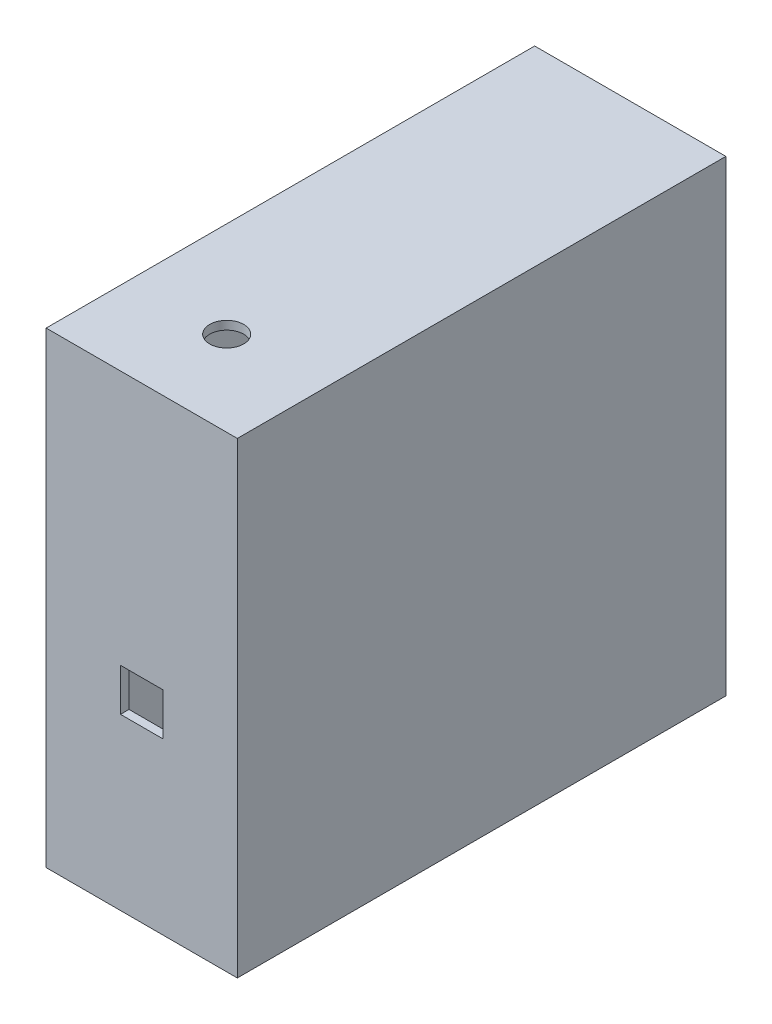
ISO-10303-21;
HEADER;
FILE_DESCRIPTION(('STEP AP214'),'2;1');
FILE_NAME('part.step','',(''),(''),'','','');
FILE_SCHEMA(('AUTOMOTIVE_DESIGN { 1 0 10303 214 1 1 1 1 }'));
ENDSEC;
DATA;
#1=APPLICATION_CONTEXT('core data for automotive mechanical design processes');
#2=APPLICATION_PROTOCOL_DEFINITION('international standard','automotive_design',2000,#1);
#3=PRODUCT_CONTEXT('',#1,'mechanical');
#4=PRODUCT('Part','Part','',(#3));
#5=PRODUCT_RELATED_PRODUCT_CATEGORY('part','',(#4));
#6=PRODUCT_DEFINITION_FORMATION('','',#4);
#7=PRODUCT_DEFINITION_CONTEXT('part definition',#1,'design');
#8=PRODUCT_DEFINITION('design','',#6,#7);
#9=PRODUCT_DEFINITION_SHAPE('','',#8);
#10=(LENGTH_UNIT() NAMED_UNIT(*) SI_UNIT(.MILLI.,.METRE.));
#11=(NAMED_UNIT(*) PLANE_ANGLE_UNIT() SI_UNIT($,.RADIAN.));
#12=(NAMED_UNIT(*) SI_UNIT($,.STERADIAN.) SOLID_ANGLE_UNIT());
#13=UNCERTAINTY_MEASURE_WITH_UNIT(LENGTH_MEASURE(1.E-05),#10,'distance_accuracy_value','');
#14=(GEOMETRIC_REPRESENTATION_CONTEXT(3) GLOBAL_UNCERTAINTY_ASSIGNED_CONTEXT((#13)) GLOBAL_UNIT_ASSIGNED_CONTEXT((#10,
#11,#12)) REPRESENTATION_CONTEXT('',''));
#15=CARTESIAN_POINT('',(0.,0.,0.));
#16=DIRECTION('',(0.,0.,1.));
#17=DIRECTION('',(1.,0.,0.));
#18=AXIS2_PLACEMENT_3D('',#15,#16,#17);
#19=CARTESIAN_POINT('',(0.,0.,0.));
#20=DIRECTION('',(0.,0.,-1.));
#21=DIRECTION('',(-1.,0.,0.));
#22=AXIS2_PLACEMENT_3D('',#19,#20,#21);
#23=PLANE('',#22);
#24=DIRECTION('',(1.,0.,0.));
#25=VECTOR('',#24,1.);
#26=CARTESIAN_POINT('',(0.,0.,0.));
#27=LINE('',#26,#25);
#28=CARTESIAN_POINT('',(-45.,0.,0.));
#29=VERTEX_POINT('',#28);
#30=CARTESIAN_POINT('',(0.,0.,0.));
#31=VERTEX_POINT('',#30);
#32=EDGE_CURVE('E192',#29,#31,#27,.T.);
#33=ORIENTED_EDGE('',*,*,#32,.F.);
#34=DIRECTION('',(0.,-1.,0.));
#35=VECTOR('',#34,1.);
#36=CARTESIAN_POINT('',(-45.,0.,0.));
#37=LINE('',#36,#35);
#38=CARTESIAN_POINT('',(-45.,110.,0.));
#39=VERTEX_POINT('',#38);
#40=EDGE_CURVE('E236',#39,#29,#37,.T.);
#41=ORIENTED_EDGE('',*,*,#40,.F.);
#42=DIRECTION('',(-1.,0.,0.));
#43=VECTOR('',#42,1.);
#44=CARTESIAN_POINT('',(0.,110.,0.));
#45=LINE('',#44,#43);
#46=CARTESIAN_POINT('',(0.,110.,0.));
#47=VERTEX_POINT('',#46);
#48=EDGE_CURVE('E252',#47,#39,#45,.T.);
#49=ORIENTED_EDGE('',*,*,#48,.F.);
#50=DIRECTION('',(0.,1.,0.));
#51=VECTOR('',#50,1.);
#52=CARTESIAN_POINT('',(0.,0.,0.));
#53=LINE('',#52,#51);
#54=EDGE_CURVE('E249',#31,#47,#53,.T.);
#55=ORIENTED_EDGE('',*,*,#54,.F.);
#56=EDGE_LOOP('',(#33,#41,#49,#55));
#57=FACE_BOUND('',#56,.T.);
#58=DIRECTION('',(0.,-1.,0.));
#59=VECTOR('',#58,1.);
#60=CARTESIAN_POINT('',(-43.,0.,0.));
#61=LINE('',#60,#59);
#62=CARTESIAN_POINT('',(-43.,108.,0.));
#63=VERTEX_POINT('',#62);
#64=CARTESIAN_POINT('',(-43.,2.,0.));
#65=VERTEX_POINT('',#64);
#66=EDGE_CURVE('E199',#63,#65,#61,.T.);
#67=ORIENTED_EDGE('',*,*,#66,.T.);
#68=DIRECTION('',(1.,0.,0.));
#69=VECTOR('',#68,1.);
#70=CARTESIAN_POINT('',(0.,2.,0.));
#71=LINE('',#70,#69);
#72=CARTESIAN_POINT('',(-2.,2.,0.));
#73=VERTEX_POINT('',#72);
#74=EDGE_CURVE('E187',#65,#73,#71,.T.);
#75=ORIENTED_EDGE('',*,*,#74,.T.);
#76=DIRECTION('',(0.,1.,0.));
#77=VECTOR('',#76,1.);
#78=CARTESIAN_POINT('',(-2.,0.,0.));
#79=LINE('',#78,#77);
#80=CARTESIAN_POINT('',(-2.,108.,0.));
#81=VERTEX_POINT('',#80);
#82=EDGE_CURVE('E220',#73,#81,#79,.T.);
#83=ORIENTED_EDGE('',*,*,#82,.T.);
#84=DIRECTION('',(-1.,0.,0.));
#85=VECTOR('',#84,1.);
#86=CARTESIAN_POINT('',(2.66453525910037E-13,108.,0.));
#87=LINE('',#86,#85);
#88=EDGE_CURVE('E224',#81,#63,#87,.T.);
#89=ORIENTED_EDGE('',*,*,#88,.T.);
#90=EDGE_LOOP('',(#67,#75,#83,#89));
#91=FACE_BOUND('',#90,.T.);
#92=ADVANCED_FACE('F44',(#57,#91),#23,.T.);
#93=CARTESIAN_POINT('',(0.,0.,115.));
#94=DIRECTION('',(0.,1.,0.));
#95=DIRECTION('',(0.,0.,1.));
#96=AXIS2_PLACEMENT_3D('',#93,#94,#95);
#97=PLANE('',#96);
#98=CARTESIAN_POINT('',(-22.5,0.,25.));
#99=DIRECTION('',(0.,-1.,0.));
#100=DIRECTION('',(0.,0.,-1.));
#101=AXIS2_PLACEMENT_3D('',#98,#99,#100);
#102=CIRCLE('',#101,16.5);
#103=CARTESIAN_POINT('',(-22.5,0.,8.5));
#104=VERTEX_POINT('',#103);
#105=EDGE_CURVE('E183',#104,#104,#102,.T.);
#106=ORIENTED_EDGE('',*,*,#105,.F.);
#107=EDGE_LOOP('',(#106));
#108=FACE_BOUND('',#107,.T.);
#109=ORIENTED_EDGE('',*,*,#32,.T.);
#110=DIRECTION('',(0.,0.,-1.));
#111=VECTOR('',#110,1.);
#112=CARTESIAN_POINT('',(0.,0.,115.));
#113=LINE('',#112,#111);
#114=CARTESIAN_POINT('',(0.,0.,115.));
#115=VERTEX_POINT('',#114);
#116=EDGE_CURVE('E11',#115,#31,#113,.T.);
#117=ORIENTED_EDGE('',*,*,#116,.F.);
#118=DIRECTION('',(1.,0.,0.));
#119=VECTOR('',#118,1.);
#120=CARTESIAN_POINT('',(0.,0.,115.));
#121=LINE('',#120,#119);
#122=CARTESIAN_POINT('',(-45.,0.,115.));
#123=VERTEX_POINT('',#122);
#124=EDGE_CURVE('E231',#123,#115,#121,.T.);
#125=ORIENTED_EDGE('',*,*,#124,.F.);
#126=DIRECTION('',(0.,0.,-1.));
#127=VECTOR('',#126,1.);
#128=CARTESIAN_POINT('',(-45.,0.,115.));
#129=LINE('',#128,#127);
#130=EDGE_CURVE('E245',#123,#29,#129,.T.);
#131=ORIENTED_EDGE('',*,*,#130,.T.);
#132=EDGE_LOOP('',(#109,#117,#125,#131));
#133=FACE_BOUND('',#132,.T.);
#134=ADVANCED_FACE('F46',(#108,#133),#97,.F.);
#135=CARTESIAN_POINT('',(0.,0.,115.));
#136=DIRECTION('',(-1.,0.,0.));
#137=DIRECTION('',(0.,0.,1.));
#138=AXIS2_PLACEMENT_3D('',#135,#136,#137);
#139=PLANE('',#138);
#140=ORIENTED_EDGE('',*,*,#54,.T.);
#141=DIRECTION('',(0.,0.,-1.));
#142=VECTOR('',#141,1.);
#143=CARTESIAN_POINT('',(0.,110.,115.));
#144=LINE('',#143,#142);
#145=CARTESIAN_POINT('',(0.,110.,115.));
#146=VERTEX_POINT('',#145);
#147=EDGE_CURVE('E53',#146,#47,#144,.T.);
#148=ORIENTED_EDGE('',*,*,#147,.F.);
#149=DIRECTION('',(0.,1.,0.));
#150=VECTOR('',#149,1.);
#151=CARTESIAN_POINT('',(0.,0.,115.));
#152=LINE('',#151,#150);
#153=EDGE_CURVE('E235',#115,#146,#152,.T.);
#154=ORIENTED_EDGE('',*,*,#153,.F.);
#155=ORIENTED_EDGE('',*,*,#116,.T.);
#156=EDGE_LOOP('',(#140,#148,#154,#155));
#157=FACE_BOUND('',#156,.T.);
#158=ADVANCED_FACE('F285',(#157),#139,.F.);
#159=CARTESIAN_POINT('',(0.,110.,115.));
#160=DIRECTION('',(0.,-1.,0.));
#161=DIRECTION('',(1.,0.,0.));
#162=AXIS2_PLACEMENT_3D('',#159,#160,#161);
#163=PLANE('',#162);
#164=CARTESIAN_POINT('',(-22.5,110.,95.));
#165=DIRECTION('',(0.,1.,0.));
#166=DIRECTION('',(-1.,0.,0.));
#167=AXIS2_PLACEMENT_3D('',#164,#165,#166);
#168=CIRCLE('',#167,4.);
#169=CARTESIAN_POINT('',(-26.5,110.,95.));
#170=VERTEX_POINT('',#169);
#171=EDGE_CURVE('E322',#170,#170,#168,.T.);
#172=ORIENTED_EDGE('',*,*,#171,.F.);
#173=EDGE_LOOP('',(#172));
#174=FACE_BOUND('',#173,.T.);
#175=ORIENTED_EDGE('',*,*,#48,.T.);
#176=DIRECTION('',(0.,0.,-1.));
#177=VECTOR('',#176,1.);
#178=CARTESIAN_POINT('',(-45.,110.,115.));
#179=LINE('',#178,#177);
#180=CARTESIAN_POINT('',(-45.,110.,115.));
#181=VERTEX_POINT('',#180);
#182=EDGE_CURVE('E260',#181,#39,#179,.T.);
#183=ORIENTED_EDGE('',*,*,#182,.F.);
#184=DIRECTION('',(-1.,0.,0.));
#185=VECTOR('',#184,1.);
#186=CARTESIAN_POINT('',(0.,110.,115.));
#187=LINE('',#186,#185);
#188=EDGE_CURVE('E239',#146,#181,#187,.T.);
#189=ORIENTED_EDGE('',*,*,#188,.F.);
#190=ORIENTED_EDGE('',*,*,#147,.T.);
#191=EDGE_LOOP('',(#175,#183,#189,#190));
#192=FACE_BOUND('',#191,.T.);
#193=ADVANCED_FACE('F269',(#174,#192),#163,.F.);
#194=CARTESIAN_POINT('',(-45.,0.,115.));
#195=DIRECTION('',(1.,0.,0.));
#196=DIRECTION('',(0.,0.,-1.));
#197=AXIS2_PLACEMENT_3D('',#194,#195,#196);
#198=PLANE('',#197);
#199=ORIENTED_EDGE('',*,*,#40,.T.);
#200=ORIENTED_EDGE('',*,*,#130,.F.);
#201=DIRECTION('',(0.,-1.,0.));
#202=VECTOR('',#201,1.);
#203=CARTESIAN_POINT('',(-45.,0.,115.));
#204=LINE('',#203,#202);
#205=EDGE_CURVE('E242',#181,#123,#204,.T.);
#206=ORIENTED_EDGE('',*,*,#205,.F.);
#207=ORIENTED_EDGE('',*,*,#182,.T.);
#208=EDGE_LOOP('',(#199,#200,#206,#207));
#209=FACE_BOUND('',#208,.T.);
#210=ADVANCED_FACE('F278',(#209),#198,.F.);
#211=CARTESIAN_POINT('',(0.,0.,115.));
#212=DIRECTION('',(0.,0.,-1.));
#213=DIRECTION('',(-1.,0.,0.));
#214=AXIS2_PLACEMENT_3D('',#211,#212,#213);
#215=PLANE('',#214);
#216=DIRECTION('',(1.,0.,0.));
#217=VECTOR('',#216,1.);
#218=CARTESIAN_POINT('',(-27.5,40.,115.));
#219=LINE('',#218,#217);
#220=CARTESIAN_POINT('',(-27.5,40.,115.));
#221=VERTEX_POINT('',#220);
#222=CARTESIAN_POINT('',(-17.5,40.,115.));
#223=VERTEX_POINT('',#222);
#224=EDGE_CURVE('E158',#221,#223,#219,.T.);
#225=ORIENTED_EDGE('',*,*,#224,.F.);
#226=DIRECTION('',(0.,-1.,0.));
#227=VECTOR('',#226,1.);
#228=CARTESIAN_POINT('',(-27.5,50.,115.));
#229=LINE('',#228,#227);
#230=CARTESIAN_POINT('',(-27.5,50.,115.));
#231=VERTEX_POINT('',#230);
#232=EDGE_CURVE('E60',#231,#221,#229,.T.);
#233=ORIENTED_EDGE('',*,*,#232,.F.);
#234=DIRECTION('',(-1.,0.,0.));
#235=VECTOR('',#234,1.);
#236=CARTESIAN_POINT('',(-27.5,50.,115.));
#237=LINE('',#236,#235);
#238=CARTESIAN_POINT('',(-17.5,50.,115.));
#239=VERTEX_POINT('',#238);
#240=EDGE_CURVE('E148',#239,#231,#237,.T.);
#241=ORIENTED_EDGE('',*,*,#240,.F.);
#242=DIRECTION('',(0.,1.,0.));
#243=VECTOR('',#242,1.);
#244=CARTESIAN_POINT('',(-17.5,50.,115.));
#245=LINE('',#244,#243);
#246=EDGE_CURVE('E166',#223,#239,#245,.T.);
#247=ORIENTED_EDGE('',*,*,#246,.F.);
#248=EDGE_LOOP('',(#225,#233,#241,#247));
#249=FACE_BOUND('',#248,.T.);
#250=ORIENTED_EDGE('',*,*,#124,.T.);
#251=ORIENTED_EDGE('',*,*,#153,.T.);
#252=ORIENTED_EDGE('',*,*,#188,.T.);
#253=ORIENTED_EDGE('',*,*,#205,.T.);
#254=EDGE_LOOP('',(#250,#251,#252,#253));
#255=FACE_BOUND('',#254,.T.);
#256=ADVANCED_FACE('F284',(#249,#255),#215,.F.);
#257=CARTESIAN_POINT('',(0.,2.,115.));
#258=DIRECTION('',(0.,1.,0.));
#259=DIRECTION('',(0.,0.,1.));
#260=AXIS2_PLACEMENT_3D('',#257,#258,#259);
#261=PLANE('',#260);
#262=CARTESIAN_POINT('',(-22.5,2.,25.));
#263=DIRECTION('',(0.,1.,0.));
#264=DIRECTION('',(0.,0.,1.));
#265=AXIS2_PLACEMENT_3D('',#262,#263,#264);
#266=CIRCLE('',#265,16.5);
#267=CARTESIAN_POINT('',(-22.5,2.,41.5));
#268=VERTEX_POINT('',#267);
#269=EDGE_CURVE('E141',#268,#268,#266,.F.);
#270=ORIENTED_EDGE('',*,*,#269,.T.);
#271=EDGE_LOOP('',(#270));
#272=FACE_BOUND('',#271,.T.);
#273=ORIENTED_EDGE('',*,*,#74,.F.);
#274=DIRECTION('',(0.,0.,-1.));
#275=VECTOR('',#274,1.);
#276=CARTESIAN_POINT('',(-43.,2.,115.));
#277=LINE('',#276,#275);
#278=CARTESIAN_POINT('',(-43.,2.,113.));
#279=VERTEX_POINT('',#278);
#280=EDGE_CURVE('E200',#279,#65,#277,.T.);
#281=ORIENTED_EDGE('',*,*,#280,.F.);
#282=DIRECTION('',(1.,0.,0.));
#283=VECTOR('',#282,1.);
#284=CARTESIAN_POINT('',(0.,2.,113.));
#285=LINE('',#284,#283);
#286=CARTESIAN_POINT('',(-2.,2.,113.));
#287=VERTEX_POINT('',#286);
#288=EDGE_CURVE('E194',#279,#287,#285,.T.);
#289=ORIENTED_EDGE('',*,*,#288,.T.);
#290=DIRECTION('',(0.,0.,-1.));
#291=VECTOR('',#290,1.);
#292=CARTESIAN_POINT('',(-2.,2.,115.));
#293=LINE('',#292,#291);
#294=EDGE_CURVE('E188',#287,#73,#293,.T.);
#295=ORIENTED_EDGE('',*,*,#294,.T.);
#296=EDGE_LOOP('',(#273,#281,#289,#295));
#297=FACE_BOUND('',#296,.T.);
#298=ADVANCED_FACE('F306',(#272,#297),#261,.T.);
#299=CARTESIAN_POINT('',(-2.,0.,115.));
#300=DIRECTION('',(-1.,0.,0.));
#301=DIRECTION('',(0.,0.,1.));
#302=AXIS2_PLACEMENT_3D('',#299,#300,#301);
#303=PLANE('',#302);
#304=ORIENTED_EDGE('',*,*,#82,.F.);
#305=ORIENTED_EDGE('',*,*,#294,.F.);
#306=DIRECTION('',(0.,1.,0.));
#307=VECTOR('',#306,1.);
#308=CARTESIAN_POINT('',(-2.,0.,113.));
#309=LINE('',#308,#307);
#310=CARTESIAN_POINT('',(-2.,108.,113.));
#311=VERTEX_POINT('',#310);
#312=EDGE_CURVE('E198',#287,#311,#309,.T.);
#313=ORIENTED_EDGE('',*,*,#312,.T.);
#314=DIRECTION('',(0.,0.,-1.));
#315=VECTOR('',#314,1.);
#316=CARTESIAN_POINT('',(-2.,108.,115.));
#317=LINE('',#316,#315);
#318=EDGE_CURVE('E193',#311,#81,#317,.T.);
#319=ORIENTED_EDGE('',*,*,#318,.T.);
#320=EDGE_LOOP('',(#304,#305,#313,#319));
#321=FACE_BOUND('',#320,.T.);
#322=ADVANCED_FACE('F313',(#321),#303,.T.);
#323=CARTESIAN_POINT('',(0.,108.,115.));
#324=DIRECTION('',(0.,-1.,0.));
#325=DIRECTION('',(1.,0.,0.));
#326=AXIS2_PLACEMENT_3D('',#323,#324,#325);
#327=PLANE('',#326);
#328=CARTESIAN_POINT('',(-22.5,108.,95.));
#329=DIRECTION('',(0.,-1.,0.));
#330=DIRECTION('',(1.,0.,0.));
#331=AXIS2_PLACEMENT_3D('',#328,#329,#330);
#332=CIRCLE('',#331,4.);
#333=CARTESIAN_POINT('',(-18.5,108.,95.));
#334=VERTEX_POINT('',#333);
#335=EDGE_CURVE('E325',#334,#334,#332,.F.);
#336=ORIENTED_EDGE('',*,*,#335,.T.);
#337=EDGE_LOOP('',(#336));
#338=FACE_BOUND('',#337,.T.);
#339=ORIENTED_EDGE('',*,*,#88,.F.);
#340=ORIENTED_EDGE('',*,*,#318,.F.);
#341=DIRECTION('',(-1.,0.,0.));
#342=VECTOR('',#341,1.);
#343=CARTESIAN_POINT('',(2.66453525910037E-13,108.,113.));
#344=LINE('',#343,#342);
#345=CARTESIAN_POINT('',(-43.,108.,113.));
#346=VERTEX_POINT('',#345);
#347=EDGE_CURVE('E210',#311,#346,#344,.T.);
#348=ORIENTED_EDGE('',*,*,#347,.T.);
#349=DIRECTION('',(0.,0.,-1.));
#350=VECTOR('',#349,1.);
#351=CARTESIAN_POINT('',(-43.,108.,115.));
#352=LINE('',#351,#350);
#353=EDGE_CURVE('E203',#346,#63,#352,.T.);
#354=ORIENTED_EDGE('',*,*,#353,.T.);
#355=EDGE_LOOP('',(#339,#340,#348,#354));
#356=FACE_BOUND('',#355,.T.);
#357=ADVANCED_FACE('F332',(#338,#356),#327,.T.);
#358=CARTESIAN_POINT('',(-43.,0.,115.));
#359=DIRECTION('',(1.,0.,0.));
#360=DIRECTION('',(0.,0.,-1.));
#361=AXIS2_PLACEMENT_3D('',#358,#359,#360);
#362=PLANE('',#361);
#363=ORIENTED_EDGE('',*,*,#66,.F.);
#364=ORIENTED_EDGE('',*,*,#353,.F.);
#365=DIRECTION('',(0.,-1.,0.));
#366=VECTOR('',#365,1.);
#367=CARTESIAN_POINT('',(-43.,0.,113.));
#368=LINE('',#367,#366);
#369=EDGE_CURVE('E204',#346,#279,#368,.T.);
#370=ORIENTED_EDGE('',*,*,#369,.T.);
#371=ORIENTED_EDGE('',*,*,#280,.T.);
#372=EDGE_LOOP('',(#363,#364,#370,#371));
#373=FACE_BOUND('',#372,.T.);
#374=ADVANCED_FACE('F360',(#373),#362,.T.);
#375=CARTESIAN_POINT('',(0.,0.,113.));
#376=DIRECTION('',(0.,0.,-1.));
#377=DIRECTION('',(-1.,0.,0.));
#378=AXIS2_PLACEMENT_3D('',#375,#376,#377);
#379=PLANE('',#378);
#380=DIRECTION('',(0.,-1.,0.));
#381=VECTOR('',#380,1.);
#382=CARTESIAN_POINT('',(-27.5,50.,113.));
#383=LINE('',#382,#381);
#384=CARTESIAN_POINT('',(-27.5,50.,113.));
#385=VERTEX_POINT('',#384);
#386=CARTESIAN_POINT('',(-27.5,40.,113.));
#387=VERTEX_POINT('',#386);
#388=EDGE_CURVE('E145',#385,#387,#383,.T.);
#389=ORIENTED_EDGE('',*,*,#388,.T.);
#390=DIRECTION('',(1.,0.,0.));
#391=VECTOR('',#390,1.);
#392=CARTESIAN_POINT('',(-27.5,40.,113.));
#393=LINE('',#392,#391);
#394=CARTESIAN_POINT('',(-17.5,40.,113.));
#395=VERTEX_POINT('',#394);
#396=EDGE_CURVE('E133',#387,#395,#393,.T.);
#397=ORIENTED_EDGE('',*,*,#396,.T.);
#398=DIRECTION('',(0.,1.,0.));
#399=VECTOR('',#398,1.);
#400=CARTESIAN_POINT('',(-17.5,50.,113.));
#401=LINE('',#400,#399);
#402=CARTESIAN_POINT('',(-17.5,50.,113.));
#403=VERTEX_POINT('',#402);
#404=EDGE_CURVE('E160',#395,#403,#401,.T.);
#405=ORIENTED_EDGE('',*,*,#404,.T.);
#406=DIRECTION('',(-1.,0.,0.));
#407=VECTOR('',#406,1.);
#408=CARTESIAN_POINT('',(-27.5,50.,113.));
#409=LINE('',#408,#407);
#410=EDGE_CURVE('E153',#403,#385,#409,.T.);
#411=ORIENTED_EDGE('',*,*,#410,.T.);
#412=EDGE_LOOP('',(#389,#397,#405,#411));
#413=FACE_BOUND('',#412,.T.);
#414=ORIENTED_EDGE('',*,*,#288,.F.);
#415=ORIENTED_EDGE('',*,*,#369,.F.);
#416=ORIENTED_EDGE('',*,*,#347,.F.);
#417=ORIENTED_EDGE('',*,*,#312,.F.);
#418=EDGE_LOOP('',(#414,#415,#416,#417));
#419=FACE_BOUND('',#418,.T.);
#420=ADVANCED_FACE('F151',(#413,#419),#379,.T.);
#421=CARTESIAN_POINT('',(-22.5,110.001,25.));
#422=DIRECTION('',(0.,-1.,0.));
#423=DIRECTION('',(0.,0.,-1.));
#424=AXIS2_PLACEMENT_3D('',#421,#422,#423);
#425=CYLINDRICAL_SURFACE('',#424,16.5);
#426=ORIENTED_EDGE('',*,*,#269,.F.);
#427=EDGE_LOOP('',(#426));
#428=FACE_BOUND('',#427,.T.);
#429=ORIENTED_EDGE('',*,*,#105,.T.);
#430=EDGE_LOOP('',(#429));
#431=FACE_BOUND('',#430,.T.);
#432=ADVANCED_FACE('F354',(#428,#431),#425,.F.);
#433=CARTESIAN_POINT('',(-27.5,50.,-0.001000000000001));
#434=DIRECTION('',(-1.,0.,0.));
#435=DIRECTION('',(0.,0.,1.));
#436=AXIS2_PLACEMENT_3D('',#433,#434,#435);
#437=PLANE('',#436);
#438=DIRECTION('',(0.,0.,1.));
#439=VECTOR('',#438,1.);
#440=CARTESIAN_POINT('',(-27.5,50.,-0.001000000000001));
#441=LINE('',#440,#439);
#442=EDGE_CURVE('E142',#385,#231,#441,.T.);
#443=ORIENTED_EDGE('',*,*,#442,.T.);
#444=ORIENTED_EDGE('',*,*,#232,.T.);
#445=DIRECTION('',(0.,0.,1.));
#446=VECTOR('',#445,1.);
#447=CARTESIAN_POINT('',(-27.5,40.,-0.001000000000001));
#448=LINE('',#447,#446);
#449=EDGE_CURVE('E135',#387,#221,#448,.T.);
#450=ORIENTED_EDGE('',*,*,#449,.F.);
#451=ORIENTED_EDGE('',*,*,#388,.F.);
#452=EDGE_LOOP('',(#443,#444,#450,#451));
#453=FACE_BOUND('',#452,.T.);
#454=ADVANCED_FACE('F144',(#453),#437,.F.);
#455=CARTESIAN_POINT('',(-27.5,50.,-0.001000000000001));
#456=DIRECTION('',(0.,1.,0.));
#457=DIRECTION('',(0.,0.,1.));
#458=AXIS2_PLACEMENT_3D('',#455,#456,#457);
#459=PLANE('',#458);
#460=DIRECTION('',(0.,0.,1.));
#461=VECTOR('',#460,1.);
#462=CARTESIAN_POINT('',(-17.5,50.,-0.001000000000001));
#463=LINE('',#462,#461);
#464=EDGE_CURVE('E175',#403,#239,#463,.T.);
#465=ORIENTED_EDGE('',*,*,#464,.T.);
#466=ORIENTED_EDGE('',*,*,#240,.T.);
#467=ORIENTED_EDGE('',*,*,#442,.F.);
#468=ORIENTED_EDGE('',*,*,#410,.F.);
#469=EDGE_LOOP('',(#465,#466,#467,#468));
#470=FACE_BOUND('',#469,.T.);
#471=ADVANCED_FACE('F346',(#470),#459,.F.);
#472=CARTESIAN_POINT('',(-17.5,50.,-0.001000000000001));
#473=DIRECTION('',(1.,0.,0.));
#474=DIRECTION('',(0.,1.,0.));
#475=AXIS2_PLACEMENT_3D('',#472,#473,#474);
#476=PLANE('',#475);
#477=DIRECTION('',(0.,0.,1.));
#478=VECTOR('',#477,1.);
#479=CARTESIAN_POINT('',(-17.5,40.,-0.001000000000001));
#480=LINE('',#479,#478);
#481=EDGE_CURVE('E68',#395,#223,#480,.T.);
#482=ORIENTED_EDGE('',*,*,#481,.T.);
#483=ORIENTED_EDGE('',*,*,#246,.T.);
#484=ORIENTED_EDGE('',*,*,#464,.F.);
#485=ORIENTED_EDGE('',*,*,#404,.F.);
#486=EDGE_LOOP('',(#482,#483,#484,#485));
#487=FACE_BOUND('',#486,.T.);
#488=ADVANCED_FACE('F320',(#487),#476,.F.);
#489=CARTESIAN_POINT('',(-27.5,40.,-0.001000000000001));
#490=DIRECTION('',(0.,-1.,0.));
#491=DIRECTION('',(0.,0.,-1.));
#492=AXIS2_PLACEMENT_3D('',#489,#490,#491);
#493=PLANE('',#492);
#494=ORIENTED_EDGE('',*,*,#449,.T.);
#495=ORIENTED_EDGE('',*,*,#224,.T.);
#496=ORIENTED_EDGE('',*,*,#481,.F.);
#497=ORIENTED_EDGE('',*,*,#396,.F.);
#498=EDGE_LOOP('',(#494,#495,#496,#497));
#499=FACE_BOUND('',#498,.T.);
#500=ADVANCED_FACE('F134',(#499),#493,.F.);
#501=CARTESIAN_POINT('',(-22.5000000000003,-0.00100000000005651,95.));
#502=DIRECTION('',(0.,1.,0.));
#503=DIRECTION('',(-1.,0.,0.));
#504=AXIS2_PLACEMENT_3D('',#501,#502,#503);
#505=CYLINDRICAL_SURFACE('',#504,4.);
#506=ORIENTED_EDGE('',*,*,#335,.F.);
#507=EDGE_LOOP('',(#506));
#508=FACE_BOUND('',#507,.T.);
#509=ORIENTED_EDGE('',*,*,#171,.T.);
#510=EDGE_LOOP('',(#509));
#511=FACE_BOUND('',#510,.T.);
#512=ADVANCED_FACE('F335',(#508,#511),#505,.F.);
#513=CLOSED_SHELL('',(#92,#134,#158,#193,#210,#256,#298,#322,#357,#374,#420,#432,#454,#471,#488,
#500,#512));
#514=MANIFOLD_SOLID_BREP('B2',#513);
#515=ADVANCED_BREP_SHAPE_REPRESENTATION('',(#18,#514),#14);
#516=SHAPE_DEFINITION_REPRESENTATION(#9,#515);
ENDSEC;
END-ISO-10303-21;
